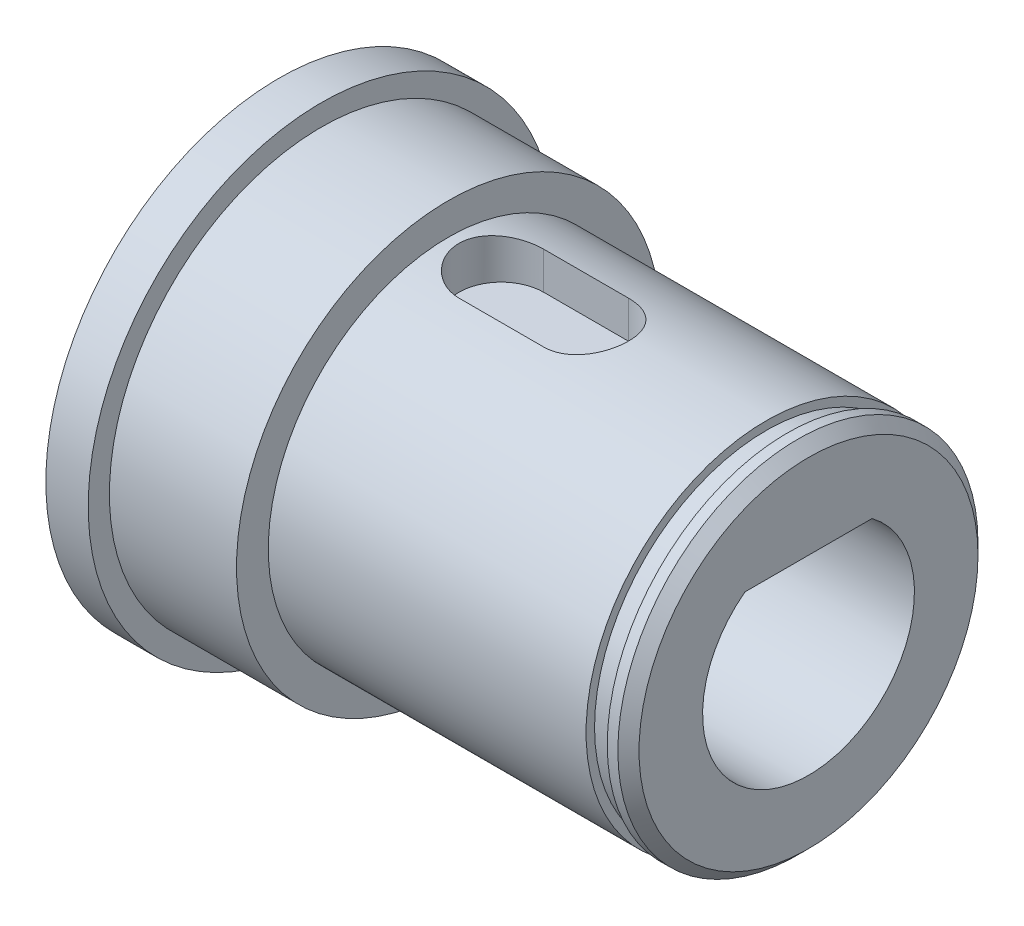
ISO-10303-21;
HEADER;
FILE_DESCRIPTION(('STEP AP214'),'2;1');
FILE_NAME('part.step','',(''),(''),'','','');
FILE_SCHEMA(('AUTOMOTIVE_DESIGN { 1 0 10303 214 1 1 1 1 }'));
ENDSEC;
DATA;
#1=APPLICATION_CONTEXT('core data for automotive mechanical design processes');
#2=APPLICATION_PROTOCOL_DEFINITION('international standard','automotive_design',2000,#1);
#3=PRODUCT_CONTEXT('',#1,'mechanical');
#4=PRODUCT('Part','Part','',(#3));
#5=PRODUCT_RELATED_PRODUCT_CATEGORY('part','',(#4));
#6=PRODUCT_DEFINITION_FORMATION('','',#4);
#7=PRODUCT_DEFINITION_CONTEXT('part definition',#1,'design');
#8=PRODUCT_DEFINITION('design','',#6,#7);
#9=PRODUCT_DEFINITION_SHAPE('','',#8);
#10=(LENGTH_UNIT() NAMED_UNIT(*) SI_UNIT(.MILLI.,.METRE.));
#11=(NAMED_UNIT(*) PLANE_ANGLE_UNIT() SI_UNIT($,.RADIAN.));
#12=(NAMED_UNIT(*) SI_UNIT($,.STERADIAN.) SOLID_ANGLE_UNIT());
#13=UNCERTAINTY_MEASURE_WITH_UNIT(LENGTH_MEASURE(1.E-05),#10,'distance_accuracy_value','');
#14=(GEOMETRIC_REPRESENTATION_CONTEXT(3) GLOBAL_UNCERTAINTY_ASSIGNED_CONTEXT((#13)) GLOBAL_UNIT_ASSIGNED_CONTEXT((#10,
#11,#12)) REPRESENTATION_CONTEXT('',''));
#15=CARTESIAN_POINT('',(0.,0.,0.));
#16=DIRECTION('',(0.,0.,1.));
#17=DIRECTION('',(1.,0.,0.));
#18=AXIS2_PLACEMENT_3D('',#15,#16,#17);
#19=CARTESIAN_POINT('',(0.,0.,0.));
#20=DIRECTION('',(1.,0.,0.));
#21=DIRECTION('',(0.,0.,-1.));
#22=AXIS2_PLACEMENT_3D('',#19,#20,#21);
#23=CYLINDRICAL_SURFACE('',#22,5.);
#24=CARTESIAN_POINT('',(5.,0.,0.));
#25=DIRECTION('',(-1.,0.,0.));
#26=DIRECTION('',(0.,0.,1.));
#27=AXIS2_PLACEMENT_3D('',#24,#25,#26);
#28=CIRCLE('',#27,5.);
#29=CARTESIAN_POINT('',(5.,4.,3.));
#30=VERTEX_POINT('',#29);
#31=CARTESIAN_POINT('',(5.,4.,-3.));
#32=VERTEX_POINT('',#31);
#33=EDGE_CURVE('E48',#30,#32,#28,.F.);
#34=ORIENTED_EDGE('',*,*,#33,.F.);
#35=DIRECTION('',(1.,0.,0.));
#36=VECTOR('',#35,1.);
#37=CARTESIAN_POINT('',(0.,4.,3.));
#38=LINE('',#37,#36);
#39=CARTESIAN_POINT('',(25.,4.,3.));
#40=VERTEX_POINT('',#39);
#41=EDGE_CURVE('E88',#30,#40,#38,.T.);
#42=ORIENTED_EDGE('',*,*,#41,.T.);
#43=CARTESIAN_POINT('',(25.,0.,0.));
#44=DIRECTION('',(1.,0.,0.));
#45=DIRECTION('',(0.,0.,-1.));
#46=AXIS2_PLACEMENT_3D('',#43,#44,#45);
#47=CIRCLE('',#46,5.);
#48=CARTESIAN_POINT('',(25.,4.,-3.));
#49=VERTEX_POINT('',#48);
#50=EDGE_CURVE('E221',#40,#49,#47,.T.);
#51=ORIENTED_EDGE('',*,*,#50,.T.);
#52=DIRECTION('',(1.,0.,0.));
#53=VECTOR('',#52,1.);
#54=CARTESIAN_POINT('',(0.,4.,-3.));
#55=LINE('',#54,#53);
#56=EDGE_CURVE('E55',#32,#49,#55,.T.);
#57=ORIENTED_EDGE('',*,*,#56,.F.);
#58=EDGE_LOOP('',(#34,#42,#51,#57));
#59=FACE_BOUND('',#58,.T.);
#60=ADVANCED_FACE('F35',(#59),#23,.F.);
#61=CARTESIAN_POINT('',(0.,4.,3.));
#62=DIRECTION('',(0.,1.,0.));
#63=DIRECTION('',(0.,0.,1.));
#64=AXIS2_PLACEMENT_3D('',#61,#62,#63);
#65=PLANE('',#64);
#66=DIRECTION('',(0.,0.,1.));
#67=VECTOR('',#66,1.);
#68=CARTESIAN_POINT('',(5.,4.,3.));
#69=LINE('',#68,#67);
#70=EDGE_CURVE('E11',#32,#30,#69,.T.);
#71=ORIENTED_EDGE('',*,*,#70,.F.);
#72=ORIENTED_EDGE('',*,*,#56,.T.);
#73=DIRECTION('',(0.,0.,1.));
#74=VECTOR('',#73,1.);
#75=CARTESIAN_POINT('',(25.,4.,3.));
#76=LINE('',#75,#74);
#77=EDGE_CURVE('E94',#49,#40,#76,.T.);
#78=ORIENTED_EDGE('',*,*,#77,.T.);
#79=ORIENTED_EDGE('',*,*,#41,.F.);
#80=EDGE_LOOP('',(#71,#72,#78,#79));
#81=FACE_BOUND('',#80,.T.);
#82=ADVANCED_FACE('F92',(#81),#65,.F.);
#83=CARTESIAN_POINT('',(25.,0.,0.));
#84=DIRECTION('',(-1.,0.,0.));
#85=DIRECTION('',(0.,0.,1.));
#86=AXIS2_PLACEMENT_3D('',#83,#84,#85);
#87=CYLINDRICAL_SURFACE('',#86,8.5);
#88=CARTESIAN_POINT('',(24.5,0.,0.));
#89=DIRECTION('',(1.,0.,0.));
#90=DIRECTION('',(0.,0.,-1.));
#91=AXIS2_PLACEMENT_3D('',#88,#89,#90);
#92=CIRCLE('',#91,8.5);
#93=CARTESIAN_POINT('',(24.5,0.,-8.5));
#94=VERTEX_POINT('',#93);
#95=EDGE_CURVE('E43',#94,#94,#92,.F.);
#96=ORIENTED_EDGE('',*,*,#95,.T.);
#97=EDGE_LOOP('',(#96));
#98=FACE_BOUND('',#97,.T.);
#99=CARTESIAN_POINT('',(24.,0.,0.));
#100=DIRECTION('',(-1.,0.,0.));
#101=DIRECTION('',(0.,0.,1.));
#102=AXIS2_PLACEMENT_3D('',#99,#100,#101);
#103=CIRCLE('',#102,8.5);
#104=CARTESIAN_POINT('',(24.,0.,8.5));
#105=VERTEX_POINT('',#104);
#106=EDGE_CURVE('E218',#105,#105,#103,.T.);
#107=ORIENTED_EDGE('',*,*,#106,.F.);
#108=EDGE_LOOP('',(#107));
#109=FACE_BOUND('',#108,.T.);
#110=ADVANCED_FACE('F154',(#98,#109),#87,.T.);
#111=CARTESIAN_POINT('',(8.,0.,0.));
#112=DIRECTION('',(1.,0.,0.));
#113=DIRECTION('',(0.,0.,-1.));
#114=AXIS2_PLACEMENT_3D('',#111,#112,#113);
#115=CIRCLE('',#114,8.5);
#116=CARTESIAN_POINT('',(8.,0.,-8.5));
#117=VERTEX_POINT('',#116);
#118=EDGE_CURVE('E126',#117,#117,#115,.T.);
#119=ORIENTED_EDGE('',*,*,#118,.T.);
#120=EDGE_LOOP('',(#119));
#121=FACE_BOUND('',#120,.T.);
#122=DIRECTION('',(-1.,0.,0.));
#123=VECTOR('',#122,1.);
#124=CARTESIAN_POINT('',(25.,8.26135582092915,-2.));
#125=LINE('',#124,#123);
#126=CARTESIAN_POINT('',(10.5,8.26135582092915,-2.));
#127=VERTEX_POINT('',#126);
#128=CARTESIAN_POINT('',(14.5,8.26135582092915,-2.));
#129=VERTEX_POINT('',#128);
#130=EDGE_CURVE('E209',#127,#129,#125,.F.);
#131=ORIENTED_EDGE('',*,*,#130,.T.);
#132=CARTESIAN_POINT('',(14.5,8.26135582092915,-2.));
#133=CARTESIAN_POINT('',(14.5554344323461,8.26135236320292,-2.00000055504916));
#134=CARTESIAN_POINT('',(14.6108415088054,8.2619144856103,-1.99769380139236));
#135=CARTESIAN_POINT('',(14.7212434339864,8.264134056541,-1.98849731170137));
#136=CARTESIAN_POINT('',(14.7762383448629,8.26579133641032,-1.98160828133565));
#137=CARTESIAN_POINT('',(14.9397976249519,8.27234056234883,-1.95416393612277));
#138=CARTESIAN_POINT('',(15.0472414713627,8.27881027991498,-1.92683096321235));
#139=CARTESIAN_POINT('',(15.2558503459617,8.29520698466521,-1.85496116677948));
#140=CARTESIAN_POINT('',(15.3570155541234,8.30513387269752,-1.81042483664592));
#141=CARTESIAN_POINT('',(15.5504829517604,8.32732086336626,-1.70546046419011));
#142=CARTESIAN_POINT('',(15.6427832183367,8.33958147049889,-1.6450289846229));
#143=CARTESIAN_POINT('',(15.8176445304476,8.36531906602219,-1.50874637759439));
#144=CARTESIAN_POINT('',(15.9000078464186,8.37881352706603,-1.43264491321001));
#145=CARTESIAN_POINT('',(16.0509339049673,8.40534737590744,-1.26771483694585));
#146=CARTESIAN_POINT('',(16.1194944666046,8.41838669151993,-1.17888421755235));
#147=CARTESIAN_POINT('',(16.2416609494937,8.442733227235,-0.989672002747236));
#148=CARTESIAN_POINT('',(16.2950732925612,8.45401726068056,-0.889162184224323));
#149=CARTESIAN_POINT('',(16.3841696035676,8.47338148505523,-0.680287309391548));
#150=CARTESIAN_POINT('',(16.4198567836348,8.48146225642124,-0.571923680419548));
#151=CARTESIAN_POINT('',(16.4718616310578,8.49338596556868,-0.352485313548641));
#152=CARTESIAN_POINT('',(16.4885167992637,8.49730265616028,-0.241494636223672));
#153=CARTESIAN_POINT('',(16.5030423420087,8.50071323920615,-0.0182275662118436));
#154=CARTESIAN_POINT('',(16.5009147660224,8.50020761420044,0.0940486848647857));
#155=CARTESIAN_POINT('',(16.4781814254168,8.49488597842209,0.3143606787062));
#156=CARTESIAN_POINT('',(16.4579401327781,8.490154991221,0.422436389839882));
#157=CARTESIAN_POINT('',(16.4001375163765,8.47701221926345,0.633611361576779));
#158=CARTESIAN_POINT('',(16.3625754802352,8.46860028311537,0.736710417304359));
#159=CARTESIAN_POINT('',(16.2708889810726,8.44890733460507,0.935993037737944));
#160=CARTESIAN_POINT('',(16.2166304990674,8.43760323594277,1.03211256730711));
#161=CARTESIAN_POINT('',(16.0931932832842,8.41335915429893,1.21400998738322));
#162=CARTESIAN_POINT('',(16.0240126125025,8.40041895903104,1.29978653304345));
#163=CARTESIAN_POINT('',(15.870735689924,8.37395331213205,1.46072775473717));
#164=CARTESIAN_POINT('',(15.7863222321904,8.36042126513727,1.53558950612902));
#165=CARTESIAN_POINT('',(15.6059723999822,8.33458019092887,1.67017505039282));
#166=CARTESIAN_POINT('',(15.5100328892058,8.32227149826905,1.72989470920644));
#167=CARTESIAN_POINT('',(15.3087960773831,8.30024752435885,1.83266918418549));
#168=CARTESIAN_POINT('',(15.2034593464437,8.29054392828406,1.87564929064842));
#169=CARTESIAN_POINT('',(14.9868380328643,8.27498678101182,1.94314531697339));
#170=CARTESIAN_POINT('',(14.8755625857552,8.26912749076621,1.96768876833644));
#171=CARTESIAN_POINT('',(14.7194550079354,8.26415363873449,1.9884132926376));
#172=CARTESIAN_POINT('',(14.6756461268753,8.26310592036969,1.99275932156623));
#173=CARTESIAN_POINT('',(14.5878983269988,8.2617074132624,1.99854927861069));
#174=CARTESIAN_POINT('',(14.5439597408004,8.26135548050657,1.99999797058451));
#175=CARTESIAN_POINT('',(14.5,8.26135582092915,2.));
#176=B_SPLINE_CURVE_WITH_KNOTS('',3,(#132,#133,#134,#135,#136,#137,#138,#139,#140,#141,#142,
#143,#144,#145,#146,#147,#148,#149,#150,#151,#152,#153,#154,#155,#156,#157,#158,#159,#160,#161,
#162,#163,#164,#165,#166,#167,#168,#169,#170,#171,#172,#173,#174,#175),.UNSPECIFIED.,.F.,.F.,(4,
2,2,2,2,2,2,2,2,2,2,2,2,2,2,2,2,2,2,2,2,4),(0.,0.166198597648889,0.332371606715104,
0.663814743733815,0.995248375734665,1.32675373757507,1.66403554066599,2.00137059509772,
2.34283993997873,2.6842473816804,3.01950170621968,3.35471945001223,3.68334015893415,
4.01197438477705,4.34331851400086,4.67470567990143,5.01401985792581,5.35342657519617,
5.69433118783423,6.03472570922611,6.16675483550179,6.29856669785088),.UNSPECIFIED.);
#177=CARTESIAN_POINT('',(14.5,8.26135582092915,2.));
#178=VERTEX_POINT('',#177);
#179=EDGE_CURVE('E129',#129,#178,#176,.T.);
#180=ORIENTED_EDGE('',*,*,#179,.T.);
#181=DIRECTION('',(-1.,0.,0.));
#182=VECTOR('',#181,1.);
#183=CARTESIAN_POINT('',(25.,8.26135582092915,2.));
#184=LINE('',#183,#182);
#185=CARTESIAN_POINT('',(10.5,8.26135582092915,2.));
#186=VERTEX_POINT('',#185);
#187=EDGE_CURVE('E206',#178,#186,#184,.T.);
#188=ORIENTED_EDGE('',*,*,#187,.T.);
#189=CARTESIAN_POINT('',(10.5,8.26135582092915,2.));
#190=CARTESIAN_POINT('',(10.4445655676539,8.26135236320292,2.00000055504916));
#191=CARTESIAN_POINT('',(10.3891584911946,8.2619144856103,1.99769380139236));
#192=CARTESIAN_POINT('',(10.2787565660136,8.264134056541,1.98849731170137));
#193=CARTESIAN_POINT('',(10.2237616551371,8.26579133641032,1.98160828133565));
#194=CARTESIAN_POINT('',(10.0602023750481,8.27234056234883,1.95416393612277));
#195=CARTESIAN_POINT('',(9.95275852863727,8.27881027991498,1.92683096321235));
#196=CARTESIAN_POINT('',(9.74414965403826,8.29520698466521,1.85496116677948));
#197=CARTESIAN_POINT('',(9.64298444587655,8.30513387269752,1.81042483664591));
#198=CARTESIAN_POINT('',(9.44951704823957,8.32732086336626,1.70546046419011));
#199=CARTESIAN_POINT('',(9.3572167816633,8.33958147049889,1.6450289846229));
#200=CARTESIAN_POINT('',(9.18235546955245,8.36531906602219,1.50874637759438));
#201=CARTESIAN_POINT('',(9.09999215358139,8.37881352706603,1.43264491321001));
#202=CARTESIAN_POINT('',(8.94906609503266,8.40534737590744,1.26771483694585));
#203=CARTESIAN_POINT('',(8.88050553339537,8.41838669151993,1.17888421755234));
#204=CARTESIAN_POINT('',(8.75833905050633,8.442733227235,0.989672002747233));
#205=CARTESIAN_POINT('',(8.7049267074388,8.45401726068056,0.889162184224321));
#206=CARTESIAN_POINT('',(8.61583039643243,8.47338148505523,0.680287309391546));
#207=CARTESIAN_POINT('',(8.58014321636518,8.48146225642124,0.571923680419545));
#208=CARTESIAN_POINT('',(8.52813836894223,8.49338596556868,0.352485313548638));
#209=CARTESIAN_POINT('',(8.51148320073626,8.49730265616028,0.241494636223669));
#210=CARTESIAN_POINT('',(8.49695765799134,8.50071323920615,0.0182275662118411));
#211=CARTESIAN_POINT('',(8.49908523397756,8.50020761420044,-0.0940486848647882));
#212=CARTESIAN_POINT('',(8.52181857458324,8.49488597842209,-0.314360678706203));
#213=CARTESIAN_POINT('',(8.54205986722187,8.490154991221,-0.422436389839885));
#214=CARTESIAN_POINT('',(8.59986248362352,8.47701221926345,-0.633611361576782));
#215=CARTESIAN_POINT('',(8.63742451976476,8.46860028311536,-0.736710417304362));
#216=CARTESIAN_POINT('',(8.72911101892744,8.44890733460507,-0.935993037737948));
#217=CARTESIAN_POINT('',(8.78336950093256,8.43760323594277,-1.03211256730711));
#218=CARTESIAN_POINT('',(8.90680671671579,8.41335915429893,-1.21400998738323));
#219=CARTESIAN_POINT('',(8.97598738749747,8.40041895903104,-1.29978653304345));
#220=CARTESIAN_POINT('',(9.12926431007599,8.37395331213205,-1.46072775473717));
#221=CARTESIAN_POINT('',(9.21367776780957,8.36042126513727,-1.53558950612902));
#222=CARTESIAN_POINT('',(9.39402760001784,8.33458019092887,-1.67017505039283));
#223=CARTESIAN_POINT('',(9.48996711079423,8.32227149826905,-1.72989470920645));
#224=CARTESIAN_POINT('',(9.69120392261694,8.30024752435885,-1.8326691841855));
#225=CARTESIAN_POINT('',(9.79654065355633,8.29054392828406,-1.87564929064842));
#226=CARTESIAN_POINT('',(10.0131619671357,8.27498678101182,-1.94314531697339));
#227=CARTESIAN_POINT('',(10.1244374142448,8.26912749076621,-1.96768876833644));
#228=CARTESIAN_POINT('',(10.2805449920646,8.26415363873449,-1.9884132926376));
#229=CARTESIAN_POINT('',(10.3243538731247,8.26310592036969,-1.99275932156623));
#230=CARTESIAN_POINT('',(10.4121016730012,8.2617074132624,-1.99854927861069));
#231=CARTESIAN_POINT('',(10.4560402591996,8.26135548050657,-1.99999797058451));
#232=CARTESIAN_POINT('',(10.5,8.26135582092915,-2.));
#233=B_SPLINE_CURVE_WITH_KNOTS('',3,(#189,#190,#191,#192,#193,#194,#195,#196,#197,#198,#199,
#200,#201,#202,#203,#204,#205,#206,#207,#208,#209,#210,#211,#212,#213,#214,#215,#216,#217,#218,
#219,#220,#221,#222,#223,#224,#225,#226,#227,#228,#229,#230,#231,#232),.UNSPECIFIED.,.F.,.F.,(4,
2,2,2,2,2,2,2,2,2,2,2,2,2,2,2,2,2,2,2,2,4),(0.,0.166198597648889,0.332371606715106,
0.663814743733817,0.995248375734671,1.32675373757508,1.66403554066599,2.00137059509772,
2.34283993997873,2.6842473816804,3.01950170621968,3.35471945001224,3.68334015893415,
4.01197438477705,4.34331851400087,4.67470567990144,5.01401985792581,5.35342657519617,
5.69433118783423,6.03472570922612,6.16675483550179,6.29856669785088),.UNSPECIFIED.);
#234=EDGE_CURVE('E148',#186,#127,#233,.T.);
#235=ORIENTED_EDGE('',*,*,#234,.T.);
#236=EDGE_LOOP('',(#131,#180,#188,#235));
#237=FACE_BOUND('',#236,.T.);
#238=CARTESIAN_POINT('',(23.,0.,0.));
#239=DIRECTION('',(1.,0.,0.));
#240=DIRECTION('',(0.,0.,-1.));
#241=AXIS2_PLACEMENT_3D('',#238,#239,#240);
#242=CIRCLE('',#241,8.5);
#243=CARTESIAN_POINT('',(23.,0.,-8.5));
#244=VERTEX_POINT('',#243);
#245=EDGE_CURVE('E215',#244,#244,#242,.T.);
#246=ORIENTED_EDGE('',*,*,#245,.F.);
#247=EDGE_LOOP('',(#246));
#248=FACE_BOUND('',#247,.T.);
#249=ADVANCED_FACE('F268',(#121,#237,#248),#87,.T.);
#250=CARTESIAN_POINT('',(2.,0.,0.));
#251=DIRECTION('',(-1.,0.,0.));
#252=DIRECTION('',(0.,0.,1.));
#253=AXIS2_PLACEMENT_3D('',#250,#251,#252);
#254=CYLINDRICAL_SURFACE('',#253,11.);
#255=CARTESIAN_POINT('',(2.,0.,0.));
#256=DIRECTION('',(1.,0.,0.));
#257=DIRECTION('',(0.,0.,-1.));
#258=AXIS2_PLACEMENT_3D('',#255,#256,#257);
#259=CIRCLE('',#258,11.);
#260=CARTESIAN_POINT('',(2.,0.,-11.));
#261=VERTEX_POINT('',#260);
#262=EDGE_CURVE('E136',#261,#261,#259,.T.);
#263=ORIENTED_EDGE('',*,*,#262,.F.);
#264=EDGE_LOOP('',(#263));
#265=FACE_BOUND('',#264,.T.);
#266=CARTESIAN_POINT('',(0.,0.,0.));
#267=DIRECTION('',(1.,0.,0.));
#268=DIRECTION('',(0.,0.,-1.));
#269=AXIS2_PLACEMENT_3D('',#266,#267,#268);
#270=CIRCLE('',#269,11.);
#271=CARTESIAN_POINT('',(0.,0.,-11.));
#272=VERTEX_POINT('',#271);
#273=EDGE_CURVE('E133',#272,#272,#270,.T.);
#274=ORIENTED_EDGE('',*,*,#273,.T.);
#275=EDGE_LOOP('',(#274));
#276=FACE_BOUND('',#275,.T.);
#277=ADVANCED_FACE('F272',(#265,#276),#254,.T.);
#278=CARTESIAN_POINT('',(2.,0.,0.));
#279=DIRECTION('',(1.,0.,0.));
#280=DIRECTION('',(0.,0.,-1.));
#281=AXIS2_PLACEMENT_3D('',#278,#279,#280);
#282=PLANE('',#281);
#283=CARTESIAN_POINT('',(2.,0.,0.));
#284=DIRECTION('',(1.,0.,0.));
#285=DIRECTION('',(0.,0.,-1.));
#286=AXIS2_PLACEMENT_3D('',#283,#284,#285);
#287=CIRCLE('',#286,10.);
#288=CARTESIAN_POINT('',(2.,0.,-10.));
#289=VERTEX_POINT('',#288);
#290=EDGE_CURVE('E130',#289,#289,#287,.T.);
#291=ORIENTED_EDGE('',*,*,#290,.F.);
#292=EDGE_LOOP('',(#291));
#293=FACE_BOUND('',#292,.T.);
#294=ORIENTED_EDGE('',*,*,#262,.T.);
#295=EDGE_LOOP('',(#294));
#296=FACE_BOUND('',#295,.T.);
#297=ADVANCED_FACE('F277',(#293,#296),#282,.T.);
#298=CARTESIAN_POINT('',(0.,0.,0.));
#299=DIRECTION('',(1.,0.,0.));
#300=DIRECTION('',(0.,0.,-1.));
#301=AXIS2_PLACEMENT_3D('',#298,#299,#300);
#302=PLANE('',#301);
#303=CARTESIAN_POINT('',(0.,0.,0.));
#304=DIRECTION('',(-1.,0.,0.));
#305=DIRECTION('',(0.,0.,1.));
#306=AXIS2_PLACEMENT_3D('',#303,#304,#305);
#307=CIRCLE('',#306,7.5);
#308=CARTESIAN_POINT('',(0.,0.,7.5));
#309=VERTEX_POINT('',#308);
#310=EDGE_CURVE('E257',#309,#309,#307,.T.);
#311=ORIENTED_EDGE('',*,*,#310,.F.);
#312=EDGE_LOOP('',(#311));
#313=FACE_BOUND('',#312,.T.);
#314=ORIENTED_EDGE('',*,*,#273,.F.);
#315=EDGE_LOOP('',(#314));
#316=FACE_BOUND('',#315,.T.);
#317=ADVANCED_FACE('F288',(#313,#316),#302,.F.);
#318=CARTESIAN_POINT('',(8.,0.,0.));
#319=DIRECTION('',(-1.,0.,0.));
#320=DIRECTION('',(0.,0.,1.));
#321=AXIS2_PLACEMENT_3D('',#318,#319,#320);
#322=CYLINDRICAL_SURFACE('',#321,10.);
#323=CARTESIAN_POINT('',(8.,0.,0.));
#324=DIRECTION('',(1.,0.,0.));
#325=DIRECTION('',(0.,0.,-1.));
#326=AXIS2_PLACEMENT_3D('',#323,#324,#325);
#327=CIRCLE('',#326,10.);
#328=CARTESIAN_POINT('',(8.,0.,-10.));
#329=VERTEX_POINT('',#328);
#330=EDGE_CURVE('E117',#329,#329,#327,.T.);
#331=ORIENTED_EDGE('',*,*,#330,.F.);
#332=EDGE_LOOP('',(#331));
#333=FACE_BOUND('',#332,.T.);
#334=ORIENTED_EDGE('',*,*,#290,.T.);
#335=EDGE_LOOP('',(#334));
#336=FACE_BOUND('',#335,.T.);
#337=ADVANCED_FACE('F181',(#333,#336),#322,.T.);
#338=CARTESIAN_POINT('',(8.,0.,0.));
#339=DIRECTION('',(1.,0.,0.));
#340=DIRECTION('',(0.,0.,-1.));
#341=AXIS2_PLACEMENT_3D('',#338,#339,#340);
#342=PLANE('',#341);
#343=ORIENTED_EDGE('',*,*,#118,.F.);
#344=EDGE_LOOP('',(#343));
#345=FACE_BOUND('',#344,.T.);
#346=ORIENTED_EDGE('',*,*,#330,.T.);
#347=EDGE_LOOP('',(#346));
#348=FACE_BOUND('',#347,.T.);
#349=ADVANCED_FACE('F176',(#345,#348),#342,.T.);
#350=CARTESIAN_POINT('',(25.,0.,0.));
#351=DIRECTION('',(1.,0.,0.));
#352=DIRECTION('',(0.,0.,-1.));
#353=AXIS2_PLACEMENT_3D('',#350,#351,#352);
#354=PLANE('',#353);
#355=CARTESIAN_POINT('',(25.,0.,0.));
#356=DIRECTION('',(1.,0.,0.));
#357=DIRECTION('',(0.,0.,-1.));
#358=AXIS2_PLACEMENT_3D('',#355,#356,#357);
#359=CIRCLE('',#358,8.00000000000001);
#360=CARTESIAN_POINT('',(25.,0.,-8.00000000000001));
#361=VERTEX_POINT('',#360);
#362=EDGE_CURVE('E211',#361,#361,#359,.T.);
#363=ORIENTED_EDGE('',*,*,#362,.T.);
#364=EDGE_LOOP('',(#363));
#365=FACE_BOUND('',#364,.T.);
#366=ORIENTED_EDGE('',*,*,#50,.F.);
#367=ORIENTED_EDGE('',*,*,#77,.F.);
#368=EDGE_LOOP('',(#366,#367));
#369=FACE_BOUND('',#368,.T.);
#370=ADVANCED_FACE('F173',(#365,#369),#354,.T.);
#371=CARTESIAN_POINT('',(10.5,6.5,0.));
#372=DIRECTION('',(0.,1.,0.));
#373=DIRECTION('',(0.,0.,1.));
#374=AXIS2_PLACEMENT_3D('',#371,#372,#373);
#375=CYLINDRICAL_SURFACE('',#374,2.);
#376=DIRECTION('',(0.,1.,0.));
#377=VECTOR('',#376,1.);
#378=CARTESIAN_POINT('',(10.5,6.5,2.));
#379=LINE('',#378,#377);
#380=CARTESIAN_POINT('',(10.5,6.5,2.));
#381=VERTEX_POINT('',#380);
#382=EDGE_CURVE('E113',#381,#186,#379,.T.);
#383=ORIENTED_EDGE('',*,*,#382,.F.);
#384=CARTESIAN_POINT('',(10.5,6.5,0.));
#385=DIRECTION('',(0.,1.,0.));
#386=DIRECTION('',(0.,0.,1.));
#387=AXIS2_PLACEMENT_3D('',#384,#385,#386);
#388=CIRCLE('',#387,2.);
#389=CARTESIAN_POINT('',(10.5,6.5,-2.));
#390=VERTEX_POINT('',#389);
#391=EDGE_CURVE('E96',#390,#381,#388,.T.);
#392=ORIENTED_EDGE('',*,*,#391,.F.);
#393=DIRECTION('',(0.,1.,0.));
#394=VECTOR('',#393,1.);
#395=CARTESIAN_POINT('',(10.5,6.5,-2.));
#396=LINE('',#395,#394);
#397=EDGE_CURVE('E114',#390,#127,#396,.T.);
#398=ORIENTED_EDGE('',*,*,#397,.T.);
#399=ORIENTED_EDGE('',*,*,#234,.F.);
#400=EDGE_LOOP('',(#383,#392,#398,#399));
#401=FACE_BOUND('',#400,.T.);
#402=ADVANCED_FACE('F170',(#401),#375,.F.);
#403=CARTESIAN_POINT('',(10.5,6.5,-2.));
#404=DIRECTION('',(0.,0.,-1.));
#405=DIRECTION('',(-1.,0.,0.));
#406=AXIS2_PLACEMENT_3D('',#403,#404,#405);
#407=PLANE('',#406);
#408=ORIENTED_EDGE('',*,*,#397,.F.);
#409=DIRECTION('',(-1.,0.,0.));
#410=VECTOR('',#409,1.);
#411=CARTESIAN_POINT('',(10.5,6.5,-2.));
#412=LINE('',#411,#410);
#413=CARTESIAN_POINT('',(14.5,6.5,-2.));
#414=VERTEX_POINT('',#413);
#415=EDGE_CURVE('E110',#414,#390,#412,.T.);
#416=ORIENTED_EDGE('',*,*,#415,.F.);
#417=DIRECTION('',(0.,1.,0.));
#418=VECTOR('',#417,1.);
#419=CARTESIAN_POINT('',(14.5,6.5,-2.));
#420=LINE('',#419,#418);
#421=EDGE_CURVE('E118',#414,#129,#420,.T.);
#422=ORIENTED_EDGE('',*,*,#421,.T.);
#423=ORIENTED_EDGE('',*,*,#130,.F.);
#424=EDGE_LOOP('',(#408,#416,#422,#423));
#425=FACE_BOUND('',#424,.T.);
#426=ADVANCED_FACE('F164',(#425),#407,.F.);
#427=CARTESIAN_POINT('',(14.5,6.5,0.));
#428=DIRECTION('',(0.,1.,0.));
#429=DIRECTION('',(0.,0.,1.));
#430=AXIS2_PLACEMENT_3D('',#427,#428,#429);
#431=CYLINDRICAL_SURFACE('',#430,2.);
#432=ORIENTED_EDGE('',*,*,#421,.F.);
#433=CARTESIAN_POINT('',(14.5,6.5,0.));
#434=DIRECTION('',(0.,1.,0.));
#435=DIRECTION('',(0.,0.,-1.));
#436=AXIS2_PLACEMENT_3D('',#433,#434,#435);
#437=CIRCLE('',#436,2.);
#438=CARTESIAN_POINT('',(14.5,6.5,2.));
#439=VERTEX_POINT('',#438);
#440=EDGE_CURVE('E107',#439,#414,#437,.T.);
#441=ORIENTED_EDGE('',*,*,#440,.F.);
#442=DIRECTION('',(0.,1.,0.));
#443=VECTOR('',#442,1.);
#444=CARTESIAN_POINT('',(14.5,6.5,2.));
#445=LINE('',#444,#443);
#446=EDGE_CURVE('E121',#439,#178,#445,.T.);
#447=ORIENTED_EDGE('',*,*,#446,.T.);
#448=ORIENTED_EDGE('',*,*,#179,.F.);
#449=EDGE_LOOP('',(#432,#441,#447,#448));
#450=FACE_BOUND('',#449,.T.);
#451=ADVANCED_FACE('F158',(#450),#431,.F.);
#452=CARTESIAN_POINT('',(10.5,6.5,2.));
#453=DIRECTION('',(0.,0.,1.));
#454=DIRECTION('',(1.,0.,0.));
#455=AXIS2_PLACEMENT_3D('',#452,#453,#454);
#456=PLANE('',#455);
#457=ORIENTED_EDGE('',*,*,#446,.F.);
#458=DIRECTION('',(1.,0.,0.));
#459=VECTOR('',#458,1.);
#460=CARTESIAN_POINT('',(10.5,6.5,2.));
#461=LINE('',#460,#459);
#462=EDGE_CURVE('E99',#381,#439,#461,.T.);
#463=ORIENTED_EDGE('',*,*,#462,.F.);
#464=ORIENTED_EDGE('',*,*,#382,.T.);
#465=ORIENTED_EDGE('',*,*,#187,.F.);
#466=EDGE_LOOP('',(#457,#463,#464,#465));
#467=FACE_BOUND('',#466,.T.);
#468=ADVANCED_FACE('F163',(#467),#456,.F.);
#469=CARTESIAN_POINT('',(10.5,6.5,0.));
#470=DIRECTION('',(0.,1.,0.));
#471=DIRECTION('',(0.,0.,1.));
#472=AXIS2_PLACEMENT_3D('',#469,#470,#471);
#473=PLANE('',#472);
#474=ORIENTED_EDGE('',*,*,#391,.T.);
#475=ORIENTED_EDGE('',*,*,#462,.T.);
#476=ORIENTED_EDGE('',*,*,#440,.T.);
#477=ORIENTED_EDGE('',*,*,#415,.T.);
#478=EDGE_LOOP('',(#474,#475,#476,#477));
#479=FACE_BOUND('',#478,.T.);
#480=ADVANCED_FACE('F168',(#479),#473,.T.);
#481=CARTESIAN_POINT('',(24.,8.1,0.));
#482=DIRECTION('',(-1.,0.,0.));
#483=DIRECTION('',(0.,0.,1.));
#484=AXIS2_PLACEMENT_3D('',#481,#482,#483);
#485=PLANE('',#484);
#486=CARTESIAN_POINT('',(24.,0.,0.));
#487=DIRECTION('',(-1.,0.,0.));
#488=DIRECTION('',(0.,0.,1.));
#489=AXIS2_PLACEMENT_3D('',#486,#487,#488);
#490=CIRCLE('',#489,8.1);
#491=CARTESIAN_POINT('',(24.,0.,8.1));
#492=VERTEX_POINT('',#491);
#493=EDGE_CURVE('E219',#492,#492,#490,.T.);
#494=ORIENTED_EDGE('',*,*,#493,.F.);
#495=EDGE_LOOP('',(#494));
#496=FACE_BOUND('',#495,.T.);
#497=ORIENTED_EDGE('',*,*,#106,.T.);
#498=EDGE_LOOP('',(#497));
#499=FACE_BOUND('',#498,.T.);
#500=ADVANCED_FACE('F193',(#496,#499),#485,.T.);
#501=CARTESIAN_POINT('',(23.,8.1,0.));
#502=DIRECTION('',(1.,0.,0.));
#503=DIRECTION('',(0.,0.,-1.));
#504=AXIS2_PLACEMENT_3D('',#501,#502,#503);
#505=PLANE('',#504);
#506=CARTESIAN_POINT('',(23.,0.,0.));
#507=DIRECTION('',(-1.,0.,0.));
#508=DIRECTION('',(0.,0.,1.));
#509=AXIS2_PLACEMENT_3D('',#506,#507,#508);
#510=CIRCLE('',#509,8.1);
#511=CARTESIAN_POINT('',(23.,0.,8.1));
#512=VERTEX_POINT('',#511);
#513=EDGE_CURVE('E89',#512,#512,#510,.T.);
#514=ORIENTED_EDGE('',*,*,#513,.T.);
#515=EDGE_LOOP('',(#514));
#516=FACE_BOUND('',#515,.T.);
#517=ORIENTED_EDGE('',*,*,#245,.T.);
#518=EDGE_LOOP('',(#517));
#519=FACE_BOUND('',#518,.T.);
#520=ADVANCED_FACE('F198',(#516,#519),#505,.T.);
#521=CARTESIAN_POINT('',(0.,0.,0.));
#522=DIRECTION('',(-1.,0.,0.));
#523=DIRECTION('',(0.,0.,1.));
#524=AXIS2_PLACEMENT_3D('',#521,#522,#523);
#525=CYLINDRICAL_SURFACE('',#524,8.1);
#526=ORIENTED_EDGE('',*,*,#493,.T.);
#527=EDGE_LOOP('',(#526));
#528=FACE_BOUND('',#527,.T.);
#529=ORIENTED_EDGE('',*,*,#513,.F.);
#530=EDGE_LOOP('',(#529));
#531=FACE_BOUND('',#530,.T.);
#532=ADVANCED_FACE('F229',(#528,#531),#525,.T.);
#533=CARTESIAN_POINT('',(25.,0.,0.));
#534=DIRECTION('',(-1.,0.,0.));
#535=DIRECTION('',(0.,0.,1.));
#536=AXIS2_PLACEMENT_3D('',#533,#534,#535);
#537=CONICAL_SURFACE('',#536,8.00000000000001,0.785398163397445);
#538=ORIENTED_EDGE('',*,*,#95,.F.);
#539=EDGE_LOOP('',(#538));
#540=FACE_BOUND('',#539,.T.);
#541=ORIENTED_EDGE('',*,*,#362,.F.);
#542=EDGE_LOOP('',(#541));
#543=FACE_BOUND('',#542,.T.);
#544=ADVANCED_FACE('F37',(#540,#543),#537,.T.);
#545=CARTESIAN_POINT('',(5.,0.,0.));
#546=DIRECTION('',(-1.,0.,0.));
#547=DIRECTION('',(0.,0.,1.));
#548=AXIS2_PLACEMENT_3D('',#545,#546,#547);
#549=PLANE('',#548);
#550=CARTESIAN_POINT('',(5.,0.,0.));
#551=DIRECTION('',(-1.,0.,0.));
#552=DIRECTION('',(0.,0.,1.));
#553=AXIS2_PLACEMENT_3D('',#550,#551,#552);
#554=CIRCLE('',#553,7.5);
#555=CARTESIAN_POINT('',(5.,0.,7.5));
#556=VERTEX_POINT('',#555);
#557=EDGE_CURVE('E90',#556,#556,#554,.T.);
#558=ORIENTED_EDGE('',*,*,#557,.T.);
#559=EDGE_LOOP('',(#558));
#560=FACE_BOUND('',#559,.T.);
#561=ORIENTED_EDGE('',*,*,#33,.T.);
#562=ORIENTED_EDGE('',*,*,#70,.T.);
#563=EDGE_LOOP('',(#561,#562));
#564=FACE_BOUND('',#563,.T.);
#565=ADVANCED_FACE('F85',(#560,#564),#549,.T.);
#566=CARTESIAN_POINT('',(5.,0.,0.));
#567=DIRECTION('',(-1.,0.,0.));
#568=DIRECTION('',(0.,0.,1.));
#569=AXIS2_PLACEMENT_3D('',#566,#567,#568);
#570=CYLINDRICAL_SURFACE('',#569,7.5);
#571=ORIENTED_EDGE('',*,*,#557,.F.);
#572=EDGE_LOOP('',(#571));
#573=FACE_BOUND('',#572,.T.);
#574=ORIENTED_EDGE('',*,*,#310,.T.);
#575=EDGE_LOOP('',(#574));
#576=FACE_BOUND('',#575,.T.);
#577=ADVANCED_FACE('F235',(#573,#576),#570,.F.);
#578=CLOSED_SHELL('',(#60,#82,#110,#249,#277,#297,#317,#337,#349,#370,#402,#426,#451,#468,#480,
#500,#520,#532,#544,#565,#577));
#579=MANIFOLD_SOLID_BREP('B2',#578);
#580=ADVANCED_BREP_SHAPE_REPRESENTATION('',(#18,#579),#14);
#581=SHAPE_DEFINITION_REPRESENTATION(#9,#580);
ENDSEC;
END-ISO-10303-21;
